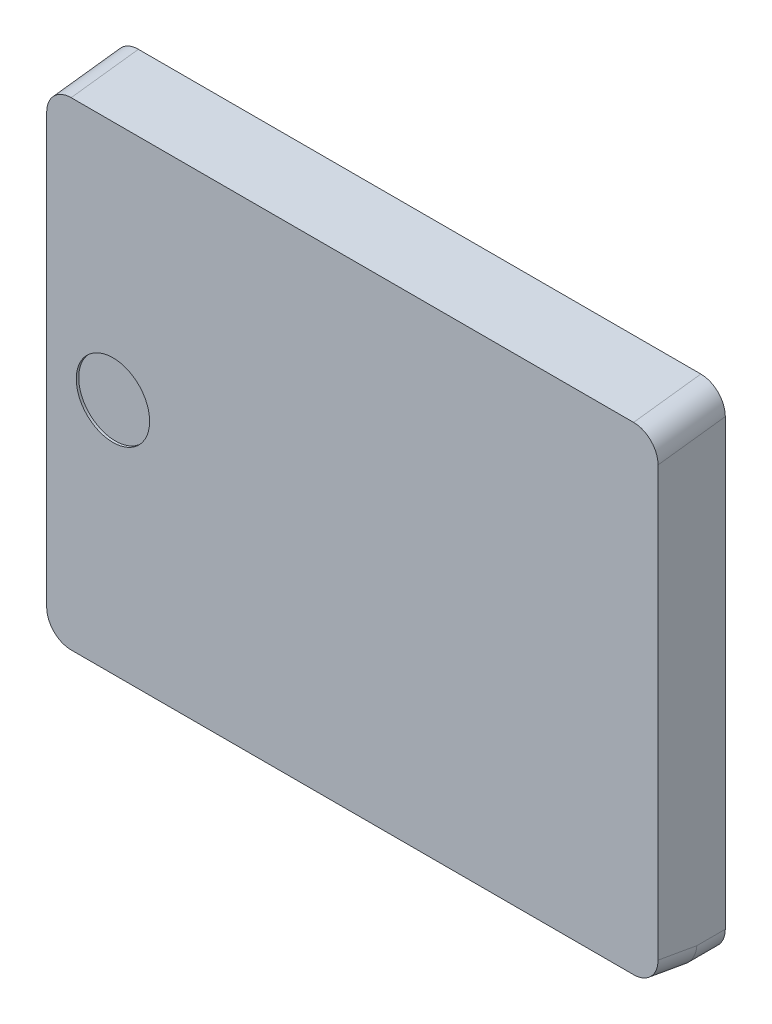
ISO-10303-21;
HEADER;
FILE_DESCRIPTION(('STEP AP214'),'2;1');
FILE_NAME('part.step','',(''),(''),'','','');
FILE_SCHEMA(('AUTOMOTIVE_DESIGN { 1 0 10303 214 1 1 1 1 }'));
ENDSEC;
DATA;
#1=APPLICATION_CONTEXT('core data for automotive mechanical design processes');
#2=APPLICATION_PROTOCOL_DEFINITION('international standard','automotive_design',2000,#1);
#3=PRODUCT_CONTEXT('',#1,'mechanical');
#4=PRODUCT('Part','Part','',(#3));
#5=PRODUCT_RELATED_PRODUCT_CATEGORY('part','',(#4));
#6=PRODUCT_DEFINITION_FORMATION('','',#4);
#7=PRODUCT_DEFINITION_CONTEXT('part definition',#1,'design');
#8=PRODUCT_DEFINITION('design','',#6,#7);
#9=PRODUCT_DEFINITION_SHAPE('','',#8);
#10=(LENGTH_UNIT() NAMED_UNIT(*) SI_UNIT(.MILLI.,.METRE.));
#11=(NAMED_UNIT(*) PLANE_ANGLE_UNIT() SI_UNIT($,.RADIAN.));
#12=(NAMED_UNIT(*) SI_UNIT($,.STERADIAN.) SOLID_ANGLE_UNIT());
#13=UNCERTAINTY_MEASURE_WITH_UNIT(LENGTH_MEASURE(1.E-05),#10,'distance_accuracy_value','');
#14=(GEOMETRIC_REPRESENTATION_CONTEXT(3) GLOBAL_UNCERTAINTY_ASSIGNED_CONTEXT((#13)) GLOBAL_UNIT_ASSIGNED_CONTEXT((#10,
#11,#12)) REPRESENTATION_CONTEXT('',''));
#15=CARTESIAN_POINT('',(0.,0.,0.));
#16=DIRECTION('',(0.,0.,1.));
#17=DIRECTION('',(1.,0.,0.));
#18=AXIS2_PLACEMENT_3D('',#15,#16,#17);
#19=CARTESIAN_POINT('',(-1.658228530191,-0.006303310763699,0.53));
#20=DIRECTION('',(0.,0.,1.));
#21=DIRECTION('',(1.,0.,0.));
#22=AXIS2_PLACEMENT_3D('',#19,#20,#21);
#23=PLANE('',#22);
#24=CARTESIAN_POINT('',(-1.958228530191,-0.006303310763699,0.53));
#25=DIRECTION('',(0.,0.,1.));
#26=DIRECTION('',(1.,0.,0.));
#27=AXIS2_PLACEMENT_3D('',#24,#25,#26);
#28=CIRCLE('',#27,0.3);
#29=CARTESIAN_POINT('',(-1.658228530191,-0.006303310763699,0.53));
#30=VERTEX_POINT('',#29);
#31=EDGE_CURVE('E20',#30,#30,#28,.T.);
#32=ORIENTED_EDGE('',*,*,#31,.T.);
#33=EDGE_LOOP('',(#32));
#34=FACE_BOUND('',#33,.T.);
#35=ADVANCED_FACE('F17',(#34),#23,.T.);
#36=CARTESIAN_POINT('',(-1.958228530191,-0.006303310763699,0.55));
#37=DIRECTION('',(0.,0.,1.));
#38=DIRECTION('',(1.,0.,0.));
#39=AXIS2_PLACEMENT_3D('',#36,#37,#38);
#40=CYLINDRICAL_SURFACE('',#39,0.3);
#41=ORIENTED_EDGE('',*,*,#31,.F.);
#42=EDGE_LOOP('',(#41));
#43=FACE_BOUND('',#42,.T.);
#44=CARTESIAN_POINT('',(-1.958228530191,-0.006303310763699,0.55));
#45=DIRECTION('',(0.,0.,1.));
#46=DIRECTION('',(1.,0.,0.));
#47=AXIS2_PLACEMENT_3D('',#44,#45,#46);
#48=CIRCLE('',#47,0.3);
#49=CARTESIAN_POINT('',(-1.658228530191,-0.006303310763699,0.55));
#50=VERTEX_POINT('',#49);
#51=EDGE_CURVE('E104',#50,#50,#48,.F.);
#52=ORIENTED_EDGE('',*,*,#51,.F.);
#53=EDGE_LOOP('',(#52));
#54=FACE_BOUND('',#53,.T.);
#55=ADVANCED_FACE('F156',(#43,#54),#40,.F.);
#56=CARTESIAN_POINT('',(2.5,-1.973550952894,0.4));
#57=DIRECTION('',(0.,-0.98480775301219,0.173648177667033));
#58=DIRECTION('',(0.,-0.173648177667033,-0.98480775301219));
#59=AXIS2_PLACEMENT_3D('',#56,#57,#58);
#60=PLANE('',#59);
#61=DIRECTION('',(0.,0.173648177667033,0.98480775301219));
#62=VECTOR('',#61,1.);
#63=CARTESIAN_POINT('',(-2.3,-1.94735483378344,0.548565574056407));
#64=LINE('',#63,#62);
#65=CARTESIAN_POINT('',(-2.3,-2.,0.250000000000925));
#66=VERTEX_POINT('',#65);
#67=CARTESIAN_POINT('',(-2.3,-1.94710190578756,0.550000000000033));
#68=VERTEX_POINT('',#67);
#69=EDGE_CURVE('E99',#66,#68,#64,.T.);
#70=ORIENTED_EDGE('',*,*,#69,.F.);
#71=DIRECTION('',(1.,0.,0.));
#72=VECTOR('',#71,1.);
#73=CARTESIAN_POINT('',(2.5,-2.,0.25));
#74=LINE('',#73,#72);
#75=CARTESIAN_POINT('',(2.3,-2.,0.250000000001046));
#76=VERTEX_POINT('',#75);
#77=EDGE_CURVE('E151',#76,#66,#74,.F.);
#78=ORIENTED_EDGE('',*,*,#77,.F.);
#79=DIRECTION('',(0.,0.173648177667033,0.98480775301219));
#80=VECTOR('',#79,1.);
#81=CARTESIAN_POINT('',(2.3,-1.95461380590344,0.507397897443407));
#82=LINE('',#81,#80);
#83=CARTESIAN_POINT('',(2.3,-1.94710190578759,0.550000000000034));
#84=VERTEX_POINT('',#83);
#85=EDGE_CURVE('E152',#84,#76,#82,.F.);
#86=ORIENTED_EDGE('',*,*,#85,.F.);
#87=DIRECTION('',(1.,0.,0.));
#88=VECTOR('',#87,1.);
#89=CARTESIAN_POINT('',(2.5,-1.947101905787,0.55));
#90=LINE('',#89,#88);
#91=EDGE_CURVE('E103',#68,#84,#90,.T.);
#92=ORIENTED_EDGE('',*,*,#91,.F.);
#93=EDGE_LOOP('',(#70,#78,#86,#92));
#94=FACE_BOUND('',#93,.T.);
#95=ADVANCED_FACE('F158',(#94),#60,.T.);
#96=CARTESIAN_POINT('',(-2.3,-1.750393283181,0.513835938523));
#97=DIRECTION('',(0.,0.173648177667033,0.98480775301219));
#98=DIRECTION('',(0.,-0.98480775301219,0.173648177667033));
#99=AXIS2_PLACEMENT_3D('',#96,#97,#98);
#100=CYLINDRICAL_SURFACE('',#99,0.2);
#101=DIRECTION('',(0.,0.173648177667966,0.984807753012025));
#102=VECTOR('',#101,1.);
#103=CARTESIAN_POINT('',(-2.5,-1.8,0.232502267295));
#104=LINE('',#103,#102);
#105=CARTESIAN_POINT('',(-2.5,-1.8,0.232502267295826));
#106=VERTEX_POINT('',#105);
#107=CARTESIAN_POINT('',(-2.5,-1.7440165834103,0.55));
#108=VERTEX_POINT('',#107);
#109=EDGE_CURVE('E97',#106,#108,#104,.T.);
#110=ORIENTED_EDGE('',*,*,#109,.F.);
#111=CARTESIAN_POINT('',(-2.3,-1.8,0.232502267296652));
#112=DIRECTION('',(0.,0.0871557427477103,0.996194698091741));
#113=DIRECTION('',(0.,-0.996194698091741,0.08715574274771));
#114=AXIS2_PLACEMENT_3D('',#111,#112,#113);
#115=ELLIPSE('',#114,0.20076396750867,0.2);
#116=EDGE_CURVE('E120',#66,#106,#115,.F.);
#117=ORIENTED_EDGE('',*,*,#116,.F.);
#118=ORIENTED_EDGE('',*,*,#69,.T.);
#119=CARTESIAN_POINT('',(-2.3,-1.7440165834106,0.55));
#120=DIRECTION('',(0.,0.,1.));
#121=DIRECTION('',(0.,1.,0.));
#122=AXIS2_PLACEMENT_3D('',#119,#120,#121);
#123=ELLIPSE('',#122,0.203085322377153,0.2);
#124=EDGE_CURVE('E92',#108,#68,#123,.T.);
#125=ORIENTED_EDGE('',*,*,#124,.F.);
#126=EDGE_LOOP('',(#110,#117,#118,#125));
#127=FACE_BOUND('',#126,.T.);
#128=ADVANCED_FACE('F94',(#127),#100,.T.);
#129=CARTESIAN_POINT('',(2.5,0.008917538609654,0.55));
#130=DIRECTION('',(0.,0.,1.));
#131=DIRECTION('',(1.,0.,0.));
#132=AXIS2_PLACEMENT_3D('',#129,#130,#131);
#133=PLANE('',#132);
#134=DIRECTION('',(1.,0.,0.));
#135=VECTOR('',#134,1.);
#136=CARTESIAN_POINT('',(2.5,1.96493698300674,0.549999999999968));
#137=LINE('',#136,#135);
#138=CARTESIAN_POINT('',(-2.3,1.9649369830068,0.549999999999984));
#139=VERTEX_POINT('',#138);
#140=CARTESIAN_POINT('',(2.3,1.96493698300677,0.549999999999985));
#141=VERTEX_POINT('',#140);
#142=EDGE_CURVE('E377',#139,#141,#137,.T.);
#143=ORIENTED_EDGE('',*,*,#142,.F.);
#144=CARTESIAN_POINT('',(-2.3,1.7634350179151,0.55));
#145=DIRECTION('',(0.,0.,1.));
#146=DIRECTION('',(0.,1.,0.));
#147=AXIS2_PLACEMENT_3D('',#144,#145,#146);
#148=ELLIPSE('',#147,0.201501965091767,0.2);
#149=CARTESIAN_POINT('',(-2.5,1.76343501791528,0.55));
#150=VERTEX_POINT('',#149);
#151=EDGE_CURVE('E111',#150,#139,#148,.F.);
#152=ORIENTED_EDGE('',*,*,#151,.F.);
#153=DIRECTION('',(0.,1.,0.));
#154=VECTOR('',#153,1.);
#155=CARTESIAN_POINT('',(-2.5,2.032468491503,0.55));
#156=LINE('',#155,#154);
#157=EDGE_CURVE('E107',#108,#150,#156,.T.);
#158=ORIENTED_EDGE('',*,*,#157,.F.);
#159=ORIENTED_EDGE('',*,*,#124,.T.);
#160=ORIENTED_EDGE('',*,*,#91,.T.);
#161=CARTESIAN_POINT('',(2.3,-1.74401658341064,0.55));
#162=DIRECTION('',(0.,0.,1.));
#163=DIRECTION('',(0.,1.,0.));
#164=AXIS2_PLACEMENT_3D('',#161,#162,#163);
#165=ELLIPSE('',#164,0.203085322377153,0.2);
#166=CARTESIAN_POINT('',(2.5,-1.74401658341032,0.55));
#167=VERTEX_POINT('',#166);
#168=EDGE_CURVE('E149',#167,#84,#165,.F.);
#169=ORIENTED_EDGE('',*,*,#168,.F.);
#170=DIRECTION('',(0.,1.,0.));
#171=VECTOR('',#170,1.);
#172=CARTESIAN_POINT('',(2.5,0.01178502355697,0.55));
#173=LINE('',#172,#171);
#174=CARTESIAN_POINT('',(2.5,1.763435017915,0.55));
#175=VERTEX_POINT('',#174);
#176=EDGE_CURVE('E367',#167,#175,#173,.T.);
#177=ORIENTED_EDGE('',*,*,#176,.T.);
#178=CARTESIAN_POINT('',(2.3,1.76343501791501,0.55));
#179=DIRECTION('',(0.,0.,1.));
#180=DIRECTION('',(0.,1.,0.));
#181=AXIS2_PLACEMENT_3D('',#178,#179,#180);
#182=ELLIPSE('',#181,0.201501965091767,0.2);
#183=EDGE_CURVE('E140',#141,#175,#182,.F.);
#184=ORIENTED_EDGE('',*,*,#183,.F.);
#185=EDGE_LOOP('',(#143,#152,#158,#159,#160,#169,#177,#184));
#186=FACE_BOUND('',#185,.T.);
#187=ORIENTED_EDGE('',*,*,#51,.T.);
#188=EDGE_LOOP('',(#187));
#189=FACE_BOUND('',#188,.T.);
#190=ADVANCED_FACE('F109',(#186,#189),#133,.T.);
#191=CARTESIAN_POINT('',(2.3,-1.757652255301,0.47266826191));
#192=DIRECTION('',(0.,0.173648177667033,0.98480775301219));
#193=DIRECTION('',(0.,-0.98480775301219,0.173648177667033));
#194=AXIS2_PLACEMENT_3D('',#191,#192,#193);
#195=CYLINDRICAL_SURFACE('',#194,0.2);
#196=DIRECTION('',(0.,0.173648177667966,0.984807753012025));
#197=VECTOR('',#196,1.);
#198=CARTESIAN_POINT('',(2.5,-1.8,0.232502267295));
#199=LINE('',#198,#197);
#200=CARTESIAN_POINT('',(2.5,-1.8,0.232502267295947));
#201=VERTEX_POINT('',#200);
#202=EDGE_CURVE('E143',#201,#167,#199,.T.);
#203=ORIENTED_EDGE('',*,*,#202,.T.);
#204=ORIENTED_EDGE('',*,*,#168,.T.);
#205=ORIENTED_EDGE('',*,*,#85,.T.);
#206=CARTESIAN_POINT('',(2.3,-1.8,0.232502267296894));
#207=DIRECTION('',(0.,0.0871557427477103,0.996194698091741));
#208=DIRECTION('',(0.,-0.996194698091741,0.08715574274771));
#209=AXIS2_PLACEMENT_3D('',#206,#207,#208);
#210=ELLIPSE('',#209,0.20076396750867,0.2);
#211=EDGE_CURVE('E137',#201,#76,#210,.F.);
#212=ORIENTED_EDGE('',*,*,#211,.F.);
#213=EDGE_LOOP('',(#203,#204,#205,#212));
#214=FACE_BOUND('',#213,.T.);
#215=ADVANCED_FACE('F205',(#214),#195,.T.);
#216=CARTESIAN_POINT('',(2.5,-2.,0.125));
#217=DIRECTION('',(0.,-1.,0.));
#218=DIRECTION('',(0.,0.,-1.));
#219=AXIS2_PLACEMENT_3D('',#216,#217,#218);
#220=PLANE('',#219);
#221=DIRECTION('',(0.,0.,1.));
#222=VECTOR('',#221,1.);
#223=CARTESIAN_POINT('',(-2.3,-2.,0.06250000000001));
#224=LINE('',#223,#222);
#225=CARTESIAN_POINT('',(-2.3,-2.,0.));
#226=VERTEX_POINT('',#225);
#227=EDGE_CURVE('E148',#226,#66,#224,.T.);
#228=ORIENTED_EDGE('',*,*,#227,.F.);
#229=DIRECTION('',(-1.,0.,0.));
#230=VECTOR('',#229,1.);
#231=CARTESIAN_POINT('',(2.5,-2.,0.));
#232=LINE('',#231,#230);
#233=CARTESIAN_POINT('',(2.3,-2.,0.));
#234=VERTEX_POINT('',#233);
#235=EDGE_CURVE('E136',#234,#226,#232,.T.);
#236=ORIENTED_EDGE('',*,*,#235,.F.);
#237=DIRECTION('',(0.,0.,1.));
#238=VECTOR('',#237,1.);
#239=CARTESIAN_POINT('',(2.3,-2.,0.198202878186));
#240=LINE('',#239,#238);
#241=EDGE_CURVE('E373',#76,#234,#240,.F.);
#242=ORIENTED_EDGE('',*,*,#241,.F.);
#243=ORIENTED_EDGE('',*,*,#77,.T.);
#244=EDGE_LOOP('',(#228,#236,#242,#243));
#245=FACE_BOUND('',#244,.T.);
#246=ADVANCED_FACE('F201',(#245),#220,.T.);
#247=CARTESIAN_POINT('',(-2.3,-1.8,0.06250000000001));
#248=DIRECTION('',(0.,0.,1.));
#249=DIRECTION('',(1.,0.,0.));
#250=AXIS2_PLACEMENT_3D('',#247,#248,#249);
#251=CYLINDRICAL_SURFACE('',#250,0.2);
#252=DIRECTION('',(0.,0.,1.));
#253=VECTOR('',#252,1.);
#254=CARTESIAN_POINT('',(-2.5,-1.8,0.));
#255=LINE('',#254,#253);
#256=CARTESIAN_POINT('',(-2.5,-1.8,0.));
#257=VERTEX_POINT('',#256);
#258=EDGE_CURVE('E118',#257,#106,#255,.T.);
#259=ORIENTED_EDGE('',*,*,#258,.F.);
#260=CARTESIAN_POINT('',(-2.3,-1.8,0.));
#261=DIRECTION('',(0.,0.,1.));
#262=DIRECTION('',(1.,0.,0.));
#263=AXIS2_PLACEMENT_3D('',#260,#261,#262);
#264=CIRCLE('',#263,0.2);
#265=EDGE_CURVE('E133',#226,#257,#264,.F.);
#266=ORIENTED_EDGE('',*,*,#265,.F.);
#267=ORIENTED_EDGE('',*,*,#227,.T.);
#268=ORIENTED_EDGE('',*,*,#116,.T.);
#269=EDGE_LOOP('',(#259,#266,#267,#268));
#270=FACE_BOUND('',#269,.T.);
#271=ADVANCED_FACE('F198',(#270),#251,.T.);
#272=CARTESIAN_POINT('',(-2.5,2.032468491503,0.));
#273=DIRECTION('',(-1.,0.,0.));
#274=DIRECTION('',(0.,0.,1.));
#275=AXIS2_PLACEMENT_3D('',#272,#273,#274);
#276=PLANE('',#275);
#277=ORIENTED_EDGE('',*,*,#157,.T.);
#278=DIRECTION('',(0.,0.121869343405041,-0.992546151641335));
#279=VECTOR('',#278,1.);
#280=CARTESIAN_POINT('',(-2.5,1.81707638405136,0.113126131319044));
#281=LINE('',#280,#279);
#282=CARTESIAN_POINT('',(-2.5,1.83096652641182,0.));
#283=VERTEX_POINT('',#282);
#284=EDGE_CURVE('E114',#283,#150,#281,.F.);
#285=ORIENTED_EDGE('',*,*,#284,.F.);
#286=DIRECTION('',(0.,1.,0.));
#287=VECTOR('',#286,1.);
#288=CARTESIAN_POINT('',(-2.5,0.01623424575168,0.));
#289=LINE('',#288,#287);
#290=EDGE_CURVE('E132',#257,#283,#289,.T.);
#291=ORIENTED_EDGE('',*,*,#290,.F.);
#292=ORIENTED_EDGE('',*,*,#258,.T.);
#293=ORIENTED_EDGE('',*,*,#109,.T.);
#294=EDGE_LOOP('',(#277,#285,#291,#292,#293));
#295=FACE_BOUND('',#294,.T.);
#296=ADVANCED_FACE('F116',(#295),#276,.T.);
#297=CARTESIAN_POINT('',(-2.3,1.817076384051,0.113126131319));
#298=DIRECTION('',(0.,0.121869343405041,-0.992546151641335));
#299=DIRECTION('',(0.,0.992546151641335,0.121869343405041));
#300=AXIS2_PLACEMENT_3D('',#297,#298,#299);
#301=CYLINDRICAL_SURFACE('',#300,0.2);
#302=ORIENTED_EDGE('',*,*,#284,.T.);
#303=ORIENTED_EDGE('',*,*,#151,.T.);
#304=DIRECTION('',(0.,-0.121869343405041,0.992546151641335));
#305=VECTOR('',#304,1.);
#306=CARTESIAN_POINT('',(-2.3,1.998702737255,0.275));
#307=LINE('',#306,#305);
#308=CARTESIAN_POINT('',(-2.3,2.03246849150327,0.));
#309=VERTEX_POINT('',#308);
#310=EDGE_CURVE('E146',#309,#139,#307,.T.);
#311=ORIENTED_EDGE('',*,*,#310,.F.);
#312=CARTESIAN_POINT('',(-2.3,1.83096652641163,0.));
#313=DIRECTION('',(0.,0.,-1.));
#314=DIRECTION('',(0.,1.,0.));
#315=AXIS2_PLACEMENT_3D('',#312,#313,#314);
#316=ELLIPSE('',#315,0.201501965091767,0.2);
#317=EDGE_CURVE('E129',#283,#309,#316,.T.);
#318=ORIENTED_EDGE('',*,*,#317,.F.);
#319=EDGE_LOOP('',(#302,#303,#311,#318));
#320=FACE_BOUND('',#319,.T.);
#321=ADVANCED_FACE('F191',(#320),#301,.T.);
#322=CARTESIAN_POINT('',(2.5,1.998702737255,0.275));
#323=DIRECTION('',(0.,0.992546151641335,0.121869343405041));
#324=DIRECTION('',(0.,-0.121869343405041,0.992546151641335));
#325=AXIS2_PLACEMENT_3D('',#322,#323,#324);
#326=PLANE('',#325);
#327=ORIENTED_EDGE('',*,*,#310,.T.);
#328=ORIENTED_EDGE('',*,*,#142,.T.);
#329=DIRECTION('',(0.,0.121869343405041,-0.992546151641335));
#330=VECTOR('',#329,1.);
#331=CARTESIAN_POINT('',(2.3,1.98416513190427,0.393399294210008));
#332=LINE('',#331,#330);
#333=CARTESIAN_POINT('',(2.3,2.03246849150323,0.));
#334=VERTEX_POINT('',#333);
#335=EDGE_CURVE('E144',#334,#141,#332,.F.);
#336=ORIENTED_EDGE('',*,*,#335,.F.);
#337=DIRECTION('',(-1.,0.,0.));
#338=VECTOR('',#337,1.);
#339=CARTESIAN_POINT('',(2.5,2.032468491503,0.));
#340=LINE('',#339,#338);
#341=EDGE_CURVE('E128',#309,#334,#340,.F.);
#342=ORIENTED_EDGE('',*,*,#341,.F.);
#343=EDGE_LOOP('',(#327,#328,#336,#342));
#344=FACE_BOUND('',#343,.T.);
#345=ADVANCED_FACE('F187',(#344),#326,.T.);
#346=CARTESIAN_POINT('',(2.3,1.785655901576,0.369025425529));
#347=DIRECTION('',(0.,0.121869343405041,-0.992546151641335));
#348=DIRECTION('',(0.,0.992546151641335,0.121869343405041));
#349=AXIS2_PLACEMENT_3D('',#346,#347,#348);
#350=CYLINDRICAL_SURFACE('',#349,0.2);
#351=ORIENTED_EDGE('',*,*,#335,.T.);
#352=ORIENTED_EDGE('',*,*,#183,.T.);
#353=DIRECTION('',(0.,0.121869343405866,-0.992546151641234));
#354=VECTOR('',#353,1.);
#355=CARTESIAN_POINT('',(2.5,1.763435017915,0.55));
#356=LINE('',#355,#354);
#357=CARTESIAN_POINT('',(2.5,1.83096652641177,0.));
#358=VERTEX_POINT('',#357);
#359=EDGE_CURVE('E370',#175,#358,#356,.T.);
#360=ORIENTED_EDGE('',*,*,#359,.T.);
#361=CARTESIAN_POINT('',(2.3,1.83096652641154,0.));
#362=DIRECTION('',(0.,0.,-1.));
#363=DIRECTION('',(0.,1.,0.));
#364=AXIS2_PLACEMENT_3D('',#361,#362,#363);
#365=ELLIPSE('',#364,0.201501965091767,0.2);
#366=EDGE_CURVE('E125',#334,#358,#365,.T.);
#367=ORIENTED_EDGE('',*,*,#366,.F.);
#368=EDGE_LOOP('',(#351,#352,#360,#367));
#369=FACE_BOUND('',#368,.T.);
#370=ADVANCED_FACE('F184',(#369),#350,.T.);
#371=CARTESIAN_POINT('',(2.5,0.01178502355697,0.271405756372));
#372=DIRECTION('',(-1.,0.,0.));
#373=DIRECTION('',(0.,0.,1.));
#374=AXIS2_PLACEMENT_3D('',#371,#372,#373);
#375=PLANE('',#374);
#376=DIRECTION('',(0.,1.,0.));
#377=VECTOR('',#376,1.);
#378=CARTESIAN_POINT('',(2.5,0.01623424575168,0.));
#379=LINE('',#378,#377);
#380=CARTESIAN_POINT('',(2.5,-1.8,0.));
#381=VERTEX_POINT('',#380);
#382=EDGE_CURVE('E26',#358,#381,#379,.F.);
#383=ORIENTED_EDGE('',*,*,#382,.F.);
#384=ORIENTED_EDGE('',*,*,#359,.F.);
#385=ORIENTED_EDGE('',*,*,#176,.F.);
#386=ORIENTED_EDGE('',*,*,#202,.F.);
#387=DIRECTION('',(0.,0.,1.));
#388=VECTOR('',#387,1.);
#389=CARTESIAN_POINT('',(2.5,-1.8,0.198202878186));
#390=LINE('',#389,#388);
#391=EDGE_CURVE('E35',#381,#201,#390,.T.);
#392=ORIENTED_EDGE('',*,*,#391,.F.);
#393=EDGE_LOOP('',(#383,#384,#385,#386,#392));
#394=FACE_BOUND('',#393,.T.);
#395=ADVANCED_FACE('F177',(#394),#375,.F.);
#396=CARTESIAN_POINT('',(2.3,-1.8,0.198202878186));
#397=DIRECTION('',(0.,0.,1.));
#398=DIRECTION('',(1.,0.,0.));
#399=AXIS2_PLACEMENT_3D('',#396,#397,#398);
#400=CYLINDRICAL_SURFACE('',#399,0.2);
#401=ORIENTED_EDGE('',*,*,#391,.T.);
#402=ORIENTED_EDGE('',*,*,#211,.T.);
#403=ORIENTED_EDGE('',*,*,#241,.T.);
#404=CARTESIAN_POINT('',(2.3,-1.8,0.));
#405=DIRECTION('',(0.,0.,1.));
#406=DIRECTION('',(1.,0.,0.));
#407=AXIS2_PLACEMENT_3D('',#404,#405,#406);
#408=CIRCLE('',#407,0.2);
#409=EDGE_CURVE('E11',#381,#234,#408,.F.);
#410=ORIENTED_EDGE('',*,*,#409,.F.);
#411=EDGE_LOOP('',(#401,#402,#403,#410));
#412=FACE_BOUND('',#411,.T.);
#413=ADVANCED_FACE('F171',(#412),#400,.T.);
#414=CARTESIAN_POINT('',(2.5,0.01623424575168,0.));
#415=DIRECTION('',(0.,0.,-1.));
#416=DIRECTION('',(-1.,0.,0.));
#417=AXIS2_PLACEMENT_3D('',#414,#415,#416);
#418=PLANE('',#417);
#419=ORIENTED_EDGE('',*,*,#382,.T.);
#420=ORIENTED_EDGE('',*,*,#409,.T.);
#421=ORIENTED_EDGE('',*,*,#235,.T.);
#422=ORIENTED_EDGE('',*,*,#265,.T.);
#423=ORIENTED_EDGE('',*,*,#290,.T.);
#424=ORIENTED_EDGE('',*,*,#317,.T.);
#425=ORIENTED_EDGE('',*,*,#341,.T.);
#426=ORIENTED_EDGE('',*,*,#366,.T.);
#427=EDGE_LOOP('',(#419,#420,#421,#422,#423,#424,#425,#426));
#428=FACE_BOUND('',#427,.T.);
#429=ADVANCED_FACE('F169',(#428),#418,.T.);
#430=CLOSED_SHELL('',(#35,#55,#95,#128,#190,#215,#246,#271,#296,#321,#345,#370,#395,#413,#429));
#431=MANIFOLD_SOLID_BREP('B1',#430);
#432=ADVANCED_BREP_SHAPE_REPRESENTATION('',(#18,#431),#14);
#433=SHAPE_DEFINITION_REPRESENTATION(#9,#432);
ENDSEC;
END-ISO-10303-21;
